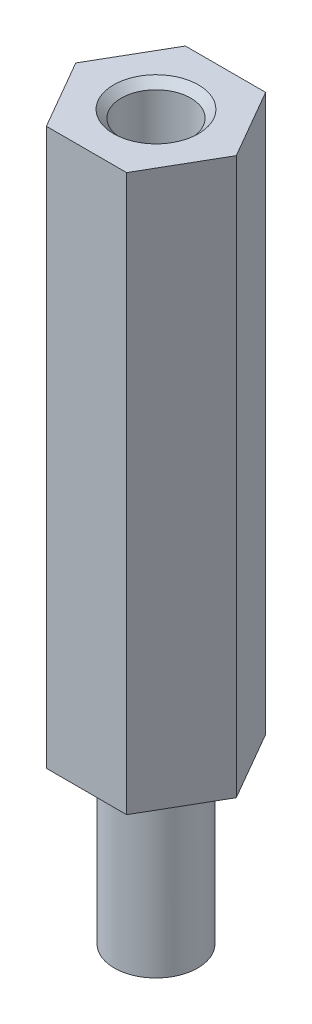
ISO-10303-21;
HEADER;
FILE_DESCRIPTION(('STEP AP214'),'2;1');
FILE_NAME('part.step','',(''),(''),'','','');
FILE_SCHEMA(('AUTOMOTIVE_DESIGN { 1 0 10303 214 1 1 1 1 }'));
ENDSEC;
DATA;
#1=APPLICATION_CONTEXT('core data for automotive mechanical design processes');
#2=APPLICATION_PROTOCOL_DEFINITION('international standard','automotive_design',2000,#1);
#3=PRODUCT_CONTEXT('',#1,'mechanical');
#4=PRODUCT('Part','Part','',(#3));
#5=PRODUCT_RELATED_PRODUCT_CATEGORY('part','',(#4));
#6=PRODUCT_DEFINITION_FORMATION('','',#4);
#7=PRODUCT_DEFINITION_CONTEXT('part definition',#1,'design');
#8=PRODUCT_DEFINITION('design','',#6,#7);
#9=PRODUCT_DEFINITION_SHAPE('','',#8);
#10=(LENGTH_UNIT() NAMED_UNIT(*) SI_UNIT(.MILLI.,.METRE.));
#11=(NAMED_UNIT(*) PLANE_ANGLE_UNIT() SI_UNIT($,.RADIAN.));
#12=(NAMED_UNIT(*) SI_UNIT($,.STERADIAN.) SOLID_ANGLE_UNIT());
#13=UNCERTAINTY_MEASURE_WITH_UNIT(LENGTH_MEASURE(1.E-05),#10,'distance_accuracy_value','');
#14=(GEOMETRIC_REPRESENTATION_CONTEXT(3) GLOBAL_UNCERTAINTY_ASSIGNED_CONTEXT((#13)) GLOBAL_UNIT_ASSIGNED_CONTEXT((#10,
#11,#12)) REPRESENTATION_CONTEXT('',''));
#15=CARTESIAN_POINT('',(0.,0.,0.));
#16=DIRECTION('',(0.,0.,1.));
#17=DIRECTION('',(1.,0.,0.));
#18=AXIS2_PLACEMENT_3D('',#15,#16,#17);
#19=CARTESIAN_POINT('',(0.,0.,0.));
#20=DIRECTION('',(0.,1.,0.));
#21=DIRECTION('',(0.,0.,1.));
#22=AXIS2_PLACEMENT_3D('',#19,#20,#21);
#23=PLANE('',#22);
#24=DIRECTION('',(0.5,0.,-0.866025403784438));
#25=VECTOR('',#24,1.);
#26=CARTESIAN_POINT('',(1.44337567297406,0.,2.50000000000001));
#27=LINE('',#26,#25);
#28=CARTESIAN_POINT('',(1.44337567297406,0.,2.50000000000001));
#29=VERTEX_POINT('',#28);
#30=CARTESIAN_POINT('',(2.88675134594813,0.,0.));
#31=VERTEX_POINT('',#30);
#32=EDGE_CURVE('E123',#29,#31,#27,.T.);
#33=ORIENTED_EDGE('',*,*,#32,.F.);
#34=DIRECTION('',(1.,0.,0.));
#35=VECTOR('',#34,1.);
#36=CARTESIAN_POINT('',(-1.44337567297407,0.,2.50000000000001));
#37=LINE('',#36,#35);
#38=CARTESIAN_POINT('',(-1.44337567297407,0.,2.50000000000001));
#39=VERTEX_POINT('',#38);
#40=EDGE_CURVE('E82',#39,#29,#37,.T.);
#41=ORIENTED_EDGE('',*,*,#40,.F.);
#42=DIRECTION('',(0.499999999999999,0.,0.866025403784439));
#43=VECTOR('',#42,1.);
#44=CARTESIAN_POINT('',(-2.88675134594814,0.,0.));
#45=LINE('',#44,#43);
#46=CARTESIAN_POINT('',(-2.88675134594814,0.,0.));
#47=VERTEX_POINT('',#46);
#48=EDGE_CURVE('E76',#47,#39,#45,.T.);
#49=ORIENTED_EDGE('',*,*,#48,.F.);
#50=DIRECTION('',(-0.5,0.,0.866025403784439));
#51=VECTOR('',#50,1.);
#52=CARTESIAN_POINT('',(-1.44337567297407,0.,-2.50000000000001));
#53=LINE('',#52,#51);
#54=CARTESIAN_POINT('',(-1.44337567297407,0.,-2.50000000000001));
#55=VERTEX_POINT('',#54);
#56=EDGE_CURVE('E113',#55,#47,#53,.T.);
#57=ORIENTED_EDGE('',*,*,#56,.F.);
#58=DIRECTION('',(-1.,0.,0.));
#59=VECTOR('',#58,1.);
#60=CARTESIAN_POINT('',(1.44337567297406,0.,-2.50000000000001));
#61=LINE('',#60,#59);
#62=CARTESIAN_POINT('',(1.44337567297406,0.,-2.50000000000001));
#63=VERTEX_POINT('',#62);
#64=EDGE_CURVE('E129',#63,#55,#61,.T.);
#65=ORIENTED_EDGE('',*,*,#64,.F.);
#66=DIRECTION('',(-0.500000000000001,0.,-0.866025403784438));
#67=VECTOR('',#66,1.);
#68=CARTESIAN_POINT('',(2.88675134594813,0.,0.));
#69=LINE('',#68,#67);
#70=EDGE_CURVE('E126',#31,#63,#69,.T.);
#71=ORIENTED_EDGE('',*,*,#70,.F.);
#72=EDGE_LOOP('',(#33,#41,#49,#57,#65,#71));
#73=FACE_BOUND('',#72,.T.);
#74=CARTESIAN_POINT('',(0.,0.,0.));
#75=DIRECTION('',(0.,1.,0.));
#76=DIRECTION('',(0.,0.,1.));
#77=AXIS2_PLACEMENT_3D('',#74,#75,#76);
#78=CIRCLE('',#77,1.5);
#79=CARTESIAN_POINT('',(0.,0.,1.5));
#80=VERTEX_POINT('',#79);
#81=EDGE_CURVE('E11',#80,#80,#78,.F.);
#82=ORIENTED_EDGE('',*,*,#81,.F.);
#83=EDGE_LOOP('',(#82));
#84=FACE_BOUND('',#83,.T.);
#85=ADVANCED_FACE('F35',(#73,#84),#23,.F.);
#86=CARTESIAN_POINT('',(1.44337567297406,20.,2.50000000000001));
#87=DIRECTION('',(-0.866025403784438,0.,-0.5));
#88=DIRECTION('',(-0.5,0.,0.866025403784438));
#89=AXIS2_PLACEMENT_3D('',#86,#87,#88);
#90=PLANE('',#89);
#91=ORIENTED_EDGE('',*,*,#32,.T.);
#92=DIRECTION('',(0.,-1.,0.));
#93=VECTOR('',#92,1.);
#94=CARTESIAN_POINT('',(2.88675134594813,20.,0.));
#95=LINE('',#94,#93);
#96=CARTESIAN_POINT('',(2.88675134594813,20.,0.));
#97=VERTEX_POINT('',#96);
#98=EDGE_CURVE('E44',#97,#31,#95,.T.);
#99=ORIENTED_EDGE('',*,*,#98,.F.);
#100=DIRECTION('',(0.5,0.,-0.866025403784438));
#101=VECTOR('',#100,1.);
#102=CARTESIAN_POINT('',(1.44337567297406,20.,2.50000000000001));
#103=LINE('',#102,#101);
#104=CARTESIAN_POINT('',(1.44337567297406,20.,2.50000000000001));
#105=VERTEX_POINT('',#104);
#106=EDGE_CURVE('E134',#105,#97,#103,.T.);
#107=ORIENTED_EDGE('',*,*,#106,.F.);
#108=DIRECTION('',(0.,-1.,0.));
#109=VECTOR('',#108,1.);
#110=CARTESIAN_POINT('',(1.44337567297406,20.,2.50000000000001));
#111=LINE('',#110,#109);
#112=EDGE_CURVE('E119',#105,#29,#111,.T.);
#113=ORIENTED_EDGE('',*,*,#112,.T.);
#114=EDGE_LOOP('',(#91,#99,#107,#113));
#115=FACE_BOUND('',#114,.T.);
#116=ADVANCED_FACE('F37',(#115),#90,.F.);
#117=CARTESIAN_POINT('',(2.88675134594813,20.,0.));
#118=DIRECTION('',(-0.866025403784438,0.,0.500000000000001));
#119=DIRECTION('',(0.500000000000001,0.,0.866025403784438));
#120=AXIS2_PLACEMENT_3D('',#117,#118,#119);
#121=PLANE('',#120);
#122=ORIENTED_EDGE('',*,*,#70,.T.);
#123=DIRECTION('',(0.,-1.,0.));
#124=VECTOR('',#123,1.);
#125=CARTESIAN_POINT('',(1.44337567297406,20.,-2.50000000000001));
#126=LINE('',#125,#124);
#127=CARTESIAN_POINT('',(1.44337567297406,20.,-2.50000000000001));
#128=VERTEX_POINT('',#127);
#129=EDGE_CURVE('E138',#128,#63,#126,.T.);
#130=ORIENTED_EDGE('',*,*,#129,.F.);
#131=DIRECTION('',(-0.500000000000001,0.,-0.866025403784438));
#132=VECTOR('',#131,1.);
#133=CARTESIAN_POINT('',(2.88675134594813,20.,0.));
#134=LINE('',#133,#132);
#135=EDGE_CURVE('E91',#97,#128,#134,.T.);
#136=ORIENTED_EDGE('',*,*,#135,.F.);
#137=ORIENTED_EDGE('',*,*,#98,.T.);
#138=EDGE_LOOP('',(#122,#130,#136,#137));
#139=FACE_BOUND('',#138,.T.);
#140=ADVANCED_FACE('F141',(#139),#121,.F.);
#141=CARTESIAN_POINT('',(1.44337567297406,20.,-2.50000000000001));
#142=DIRECTION('',(0.,0.,1.));
#143=DIRECTION('',(1.,0.,0.));
#144=AXIS2_PLACEMENT_3D('',#141,#142,#143);
#145=PLANE('',#144);
#146=ORIENTED_EDGE('',*,*,#64,.T.);
#147=DIRECTION('',(0.,-1.,0.));
#148=VECTOR('',#147,1.);
#149=CARTESIAN_POINT('',(-1.44337567297407,20.,-2.50000000000001));
#150=LINE('',#149,#148);
#151=CARTESIAN_POINT('',(-1.44337567297407,20.,-2.50000000000001));
#152=VERTEX_POINT('',#151);
#153=EDGE_CURVE('E114',#152,#55,#150,.T.);
#154=ORIENTED_EDGE('',*,*,#153,.F.);
#155=DIRECTION('',(-1.,0.,0.));
#156=VECTOR('',#155,1.);
#157=CARTESIAN_POINT('',(1.44337567297406,20.,-2.50000000000001));
#158=LINE('',#157,#156);
#159=EDGE_CURVE('E105',#128,#152,#158,.T.);
#160=ORIENTED_EDGE('',*,*,#159,.F.);
#161=ORIENTED_EDGE('',*,*,#129,.T.);
#162=EDGE_LOOP('',(#146,#154,#160,#161));
#163=FACE_BOUND('',#162,.T.);
#164=ADVANCED_FACE('F149',(#163),#145,.F.);
#165=CARTESIAN_POINT('',(-1.44337567297407,20.,-2.50000000000001));
#166=DIRECTION('',(0.866025403784439,0.,0.5));
#167=DIRECTION('',(0.5,0.,-0.866025403784439));
#168=AXIS2_PLACEMENT_3D('',#165,#166,#167);
#169=PLANE('',#168);
#170=ORIENTED_EDGE('',*,*,#56,.T.);
#171=DIRECTION('',(0.,-1.,0.));
#172=VECTOR('',#171,1.);
#173=CARTESIAN_POINT('',(-2.88675134594814,20.,0.));
#174=LINE('',#173,#172);
#175=CARTESIAN_POINT('',(-2.88675134594814,20.,0.));
#176=VERTEX_POINT('',#175);
#177=EDGE_CURVE('E110',#176,#47,#174,.T.);
#178=ORIENTED_EDGE('',*,*,#177,.F.);
#179=DIRECTION('',(-0.5,0.,0.866025403784439));
#180=VECTOR('',#179,1.);
#181=CARTESIAN_POINT('',(-1.44337567297407,20.,-2.50000000000001));
#182=LINE('',#181,#180);
#183=EDGE_CURVE('E99',#152,#176,#182,.T.);
#184=ORIENTED_EDGE('',*,*,#183,.F.);
#185=ORIENTED_EDGE('',*,*,#153,.T.);
#186=EDGE_LOOP('',(#170,#178,#184,#185));
#187=FACE_BOUND('',#186,.T.);
#188=ADVANCED_FACE('F111',(#187),#169,.F.);
#189=CARTESIAN_POINT('',(-2.88675134594814,20.,0.));
#190=DIRECTION('',(0.866025403784439,0.,-0.499999999999999));
#191=DIRECTION('',(-0.499999999999999,0.,-0.866025403784439));
#192=AXIS2_PLACEMENT_3D('',#189,#190,#191);
#193=PLANE('',#192);
#194=ORIENTED_EDGE('',*,*,#48,.T.);
#195=DIRECTION('',(0.,-1.,0.));
#196=VECTOR('',#195,1.);
#197=CARTESIAN_POINT('',(-1.44337567297407,20.,2.50000000000001));
#198=LINE('',#197,#196);
#199=CARTESIAN_POINT('',(-1.44337567297407,20.,2.50000000000001));
#200=VERTEX_POINT('',#199);
#201=EDGE_CURVE('E115',#200,#39,#198,.T.);
#202=ORIENTED_EDGE('',*,*,#201,.F.);
#203=DIRECTION('',(0.499999999999999,0.,0.866025403784439));
#204=VECTOR('',#203,1.);
#205=CARTESIAN_POINT('',(-2.88675134594814,20.,0.));
#206=LINE('',#205,#204);
#207=EDGE_CURVE('E103',#176,#200,#206,.T.);
#208=ORIENTED_EDGE('',*,*,#207,.F.);
#209=ORIENTED_EDGE('',*,*,#177,.T.);
#210=EDGE_LOOP('',(#194,#202,#208,#209));
#211=FACE_BOUND('',#210,.T.);
#212=ADVANCED_FACE('F117',(#211),#193,.F.);
#213=CARTESIAN_POINT('',(-1.44337567297407,20.,2.50000000000001));
#214=DIRECTION('',(0.,0.,-1.));
#215=DIRECTION('',(-1.,0.,0.));
#216=AXIS2_PLACEMENT_3D('',#213,#214,#215);
#217=PLANE('',#216);
#218=ORIENTED_EDGE('',*,*,#40,.T.);
#219=ORIENTED_EDGE('',*,*,#112,.F.);
#220=DIRECTION('',(1.,0.,0.));
#221=VECTOR('',#220,1.);
#222=CARTESIAN_POINT('',(-1.44337567297407,20.,2.50000000000001));
#223=LINE('',#222,#221);
#224=EDGE_CURVE('E52',#200,#105,#223,.T.);
#225=ORIENTED_EDGE('',*,*,#224,.F.);
#226=ORIENTED_EDGE('',*,*,#201,.T.);
#227=EDGE_LOOP('',(#218,#219,#225,#226));
#228=FACE_BOUND('',#227,.T.);
#229=ADVANCED_FACE('F181',(#228),#217,.F.);
#230=CARTESIAN_POINT('',(0.,20.,0.));
#231=DIRECTION('',(0.,1.,0.));
#232=DIRECTION('',(0.,0.,1.));
#233=AXIS2_PLACEMENT_3D('',#230,#231,#232);
#234=PLANE('',#233);
#235=CARTESIAN_POINT('',(0.,20.,0.));
#236=DIRECTION('',(0.,1.,0.));
#237=DIRECTION('',(0.,0.,1.));
#238=AXIS2_PLACEMENT_3D('',#235,#236,#237);
#239=CIRCLE('',#238,1.525);
#240=CARTESIAN_POINT('',(0.,20.,1.525));
#241=VERTEX_POINT('',#240);
#242=EDGE_CURVE('E158',#241,#241,#239,.T.);
#243=ORIENTED_EDGE('',*,*,#242,.F.);
#244=EDGE_LOOP('',(#243));
#245=FACE_BOUND('',#244,.T.);
#246=ORIENTED_EDGE('',*,*,#106,.T.);
#247=ORIENTED_EDGE('',*,*,#135,.T.);
#248=ORIENTED_EDGE('',*,*,#159,.T.);
#249=ORIENTED_EDGE('',*,*,#183,.T.);
#250=ORIENTED_EDGE('',*,*,#207,.T.);
#251=ORIENTED_EDGE('',*,*,#224,.T.);
#252=EDGE_LOOP('',(#246,#247,#248,#249,#250,#251));
#253=FACE_BOUND('',#252,.T.);
#254=ADVANCED_FACE('F101',(#245,#253),#234,.T.);
#255=CARTESIAN_POINT('',(0.,11.5,0.));
#256=DIRECTION('',(0.,1.,0.));
#257=DIRECTION('',(0.,0.,1.));
#258=AXIS2_PLACEMENT_3D('',#255,#256,#257);
#259=CONICAL_SURFACE('',#258,1.25,1.02974425867665);
#260=CARTESIAN_POINT('',(0.,10.7489242262155,0.));
#261=VERTEX_POINT('',#260);
#262=VERTEX_LOOP('',#261);
#263=FACE_BOUND('',#262,.T.);
#264=CARTESIAN_POINT('',(0.,11.5,0.));
#265=DIRECTION('',(0.,1.,0.));
#266=DIRECTION('',(0.,0.,1.));
#267=AXIS2_PLACEMENT_3D('',#264,#265,#266);
#268=CIRCLE('',#267,1.25);
#269=CARTESIAN_POINT('',(0.,11.5,1.25));
#270=VERTEX_POINT('',#269);
#271=EDGE_CURVE('E127',#270,#270,#268,.T.);
#272=ORIENTED_EDGE('',*,*,#271,.T.);
#273=EDGE_LOOP('',(#272));
#274=FACE_BOUND('',#273,.T.);
#275=ADVANCED_FACE('F216',(#263,#274),#259,.F.);
#276=CARTESIAN_POINT('',(0.,20.,0.));
#277=DIRECTION('',(0.,1.,0.));
#278=DIRECTION('',(0.,0.,1.));
#279=AXIS2_PLACEMENT_3D('',#276,#277,#278);
#280=CYLINDRICAL_SURFACE('',#279,1.25);
#281=ORIENTED_EDGE('',*,*,#271,.F.);
#282=EDGE_LOOP('',(#281));
#283=FACE_BOUND('',#282,.T.);
#284=CARTESIAN_POINT('',(0.,19.725,0.));
#285=DIRECTION('',(0.,1.,0.));
#286=DIRECTION('',(0.,0.,1.));
#287=AXIS2_PLACEMENT_3D('',#284,#285,#286);
#288=CIRCLE('',#287,1.25);
#289=CARTESIAN_POINT('',(0.,19.725,1.25));
#290=VERTEX_POINT('',#289);
#291=EDGE_CURVE('E155',#290,#290,#288,.T.);
#292=ORIENTED_EDGE('',*,*,#291,.T.);
#293=EDGE_LOOP('',(#292));
#294=FACE_BOUND('',#293,.T.);
#295=ADVANCED_FACE('F223',(#283,#294),#280,.F.);
#296=CARTESIAN_POINT('',(0.,20.,0.));
#297=DIRECTION('',(0.,1.,0.));
#298=DIRECTION('',(0.,0.,1.));
#299=AXIS2_PLACEMENT_3D('',#296,#297,#298);
#300=CONICAL_SURFACE('',#299,1.525,0.785398163397448);
#301=ORIENTED_EDGE('',*,*,#291,.F.);
#302=EDGE_LOOP('',(#301));
#303=FACE_BOUND('',#302,.T.);
#304=ORIENTED_EDGE('',*,*,#242,.T.);
#305=EDGE_LOOP('',(#304));
#306=FACE_BOUND('',#305,.T.);
#307=ADVANCED_FACE('F170',(#303,#306),#300,.F.);
#308=CARTESIAN_POINT('',(0.,-6.,0.));
#309=DIRECTION('',(0.,1.,0.));
#310=DIRECTION('',(0.,0.,1.));
#311=AXIS2_PLACEMENT_3D('',#308,#309,#310);
#312=CYLINDRICAL_SURFACE('',#311,1.5);
#313=CARTESIAN_POINT('',(0.,-6.,0.));
#314=DIRECTION('',(0.,-1.,0.));
#315=DIRECTION('',(0.,0.,-1.));
#316=AXIS2_PLACEMENT_3D('',#313,#314,#315);
#317=CIRCLE('',#316,1.5);
#318=CARTESIAN_POINT('',(0.,-6.,-1.5));
#319=VERTEX_POINT('',#318);
#320=EDGE_CURVE('E161',#319,#319,#317,.T.);
#321=ORIENTED_EDGE('',*,*,#320,.F.);
#322=EDGE_LOOP('',(#321));
#323=FACE_BOUND('',#322,.T.);
#324=ORIENTED_EDGE('',*,*,#81,.T.);
#325=EDGE_LOOP('',(#324));
#326=FACE_BOUND('',#325,.T.);
#327=ADVANCED_FACE('F167',(#323,#326),#312,.T.);
#328=CARTESIAN_POINT('',(0.,-6.,0.));
#329=DIRECTION('',(0.,-1.,0.));
#330=DIRECTION('',(0.,0.,-1.));
#331=AXIS2_PLACEMENT_3D('',#328,#329,#330);
#332=PLANE('',#331);
#333=ORIENTED_EDGE('',*,*,#320,.T.);
#334=EDGE_LOOP('',(#333));
#335=FACE_BOUND('',#334,.T.);
#336=ADVANCED_FACE('F165',(#335),#332,.T.);
#337=CLOSED_SHELL('',(#85,#116,#140,#164,#188,#212,#229,#254,#275,#295,#307,#327,#336));
#338=MANIFOLD_SOLID_BREP('B2',#337);
#339=ADVANCED_BREP_SHAPE_REPRESENTATION('',(#18,#338),#14);
#340=SHAPE_DEFINITION_REPRESENTATION(#9,#339);
ENDSEC;
END-ISO-10303-21;
